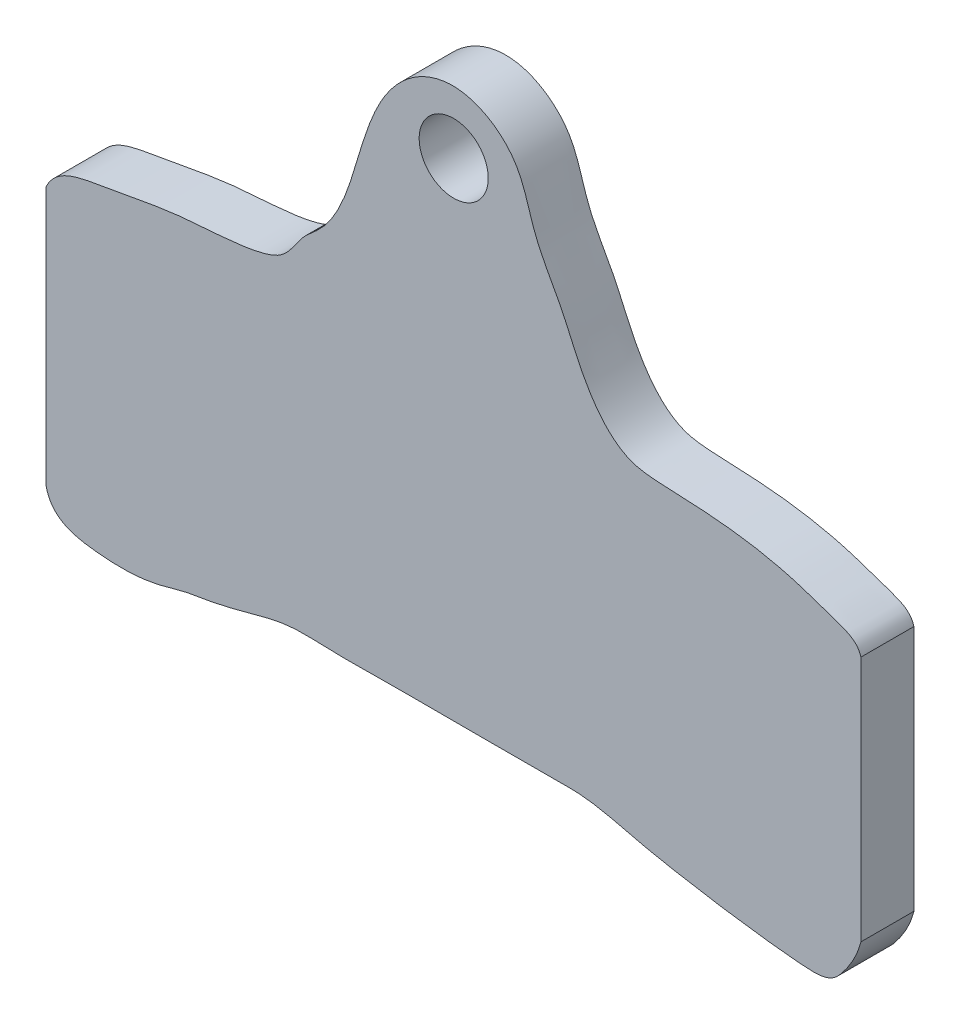
ISO-10303-21;
HEADER;
FILE_DESCRIPTION(('STEP AP214'),'2;1');
FILE_NAME('part.step','',(''),(''),'','','');
FILE_SCHEMA(('AUTOMOTIVE_DESIGN { 1 0 10303 214 1 1 1 1 }'));
ENDSEC;
DATA;
#1=APPLICATION_CONTEXT('core data for automotive mechanical design processes');
#2=APPLICATION_PROTOCOL_DEFINITION('international standard','automotive_design',2000,#1);
#3=PRODUCT_CONTEXT('',#1,'mechanical');
#4=PRODUCT('Part','Part','',(#3));
#5=PRODUCT_RELATED_PRODUCT_CATEGORY('part','',(#4));
#6=PRODUCT_DEFINITION_FORMATION('','',#4);
#7=PRODUCT_DEFINITION_CONTEXT('part definition',#1,'design');
#8=PRODUCT_DEFINITION('design','',#6,#7);
#9=PRODUCT_DEFINITION_SHAPE('','',#8);
#10=(LENGTH_UNIT() NAMED_UNIT(*) SI_UNIT(.MILLI.,.METRE.));
#11=(NAMED_UNIT(*) PLANE_ANGLE_UNIT() SI_UNIT($,.RADIAN.));
#12=(NAMED_UNIT(*) SI_UNIT($,.STERADIAN.) SOLID_ANGLE_UNIT());
#13=UNCERTAINTY_MEASURE_WITH_UNIT(LENGTH_MEASURE(1.E-05),#10,'distance_accuracy_value','');
#14=(GEOMETRIC_REPRESENTATION_CONTEXT(3) GLOBAL_UNCERTAINTY_ASSIGNED_CONTEXT((#13)) GLOBAL_UNIT_ASSIGNED_CONTEXT((#10,
#11,#12)) REPRESENTATION_CONTEXT('',''));
#15=CARTESIAN_POINT('',(0.,0.,0.));
#16=DIRECTION('',(0.,0.,1.));
#17=DIRECTION('',(1.,0.,0.));
#18=AXIS2_PLACEMENT_3D('',#15,#16,#17);
#19=CARTESIAN_POINT('',(30.9284473601599,54.5718095407916,3.8));
#20=DIRECTION('',(0.,0.,1.));
#21=DIRECTION('',(1.,0.,0.));
#22=AXIS2_PLACEMENT_3D('',#19,#20,#21);
#23=PLANE('',#22);
#24=CARTESIAN_POINT('',(60.1059481713367,33.7345558120551,3.8));
#25=CARTESIAN_POINT('',(59.9141223487883,34.464286867927,3.8));
#26=CARTESIAN_POINT('',(58.8611370620931,34.9494551013564,3.8));
#27=CARTESIAN_POINT('',(57.2260122849374,35.4782425190028,3.8));
#28=CARTESIAN_POINT('',(54.3900102713112,36.4794029735116,3.8));
#29=CARTESIAN_POINT('',(50.5185385561697,37.1346389358301,3.8));
#30=CARTESIAN_POINT('',(46.5674272276882,37.2926719448553,3.8));
#31=CARTESIAN_POINT('',(42.8629709774205,37.4816294433254,3.8));
#32=CARTESIAN_POINT('',(40.2225771694843,40.743414327897,3.8));
#33=CARTESIAN_POINT('',(38.8024751430821,44.677393091179,3.8));
#34=CARTESIAN_POINT('',(36.5608202425962,48.1529942316246,3.8));
#35=CARTESIAN_POINT('',(35.9224715698051,51.7608890450939,3.8));
#36=CARTESIAN_POINT('',(33.5639231845027,54.0065015765672,3.8));
#37=CARTESIAN_POINT('',(31.0123339168426,54.8048272035527,3.8));
#38=CARTESIAN_POINT('',(28.6765416131809,54.2078161368735,3.8));
#39=CARTESIAN_POINT('',(25.7017243009681,51.8846296080188,3.8));
#40=CARTESIAN_POINT('',(24.0715140181778,46.8241245917883,3.8));
#41=CARTESIAN_POINT('',(22.6760180554024,41.8513341769035,3.8));
#42=CARTESIAN_POINT('',(19.8703862826899,39.7065345486074,3.8));
#43=CARTESIAN_POINT('',(19.0424772859429,37.8975655709656,3.8));
#44=CARTESIAN_POINT('',(16.2644619365686,37.0497757996661,3.8));
#45=CARTESIAN_POINT('',(13.5716016364334,36.9027341084685,3.8));
#46=CARTESIAN_POINT('',(10.4500749891777,36.6374400645459,3.8));
#47=CARTESIAN_POINT('',(7.89783576133975,36.1586513142713,3.8));
#48=CARTESIAN_POINT('',(4.79532972626533,35.6152884579559,3.8));
#49=CARTESIAN_POINT('',(2.42126894283623,35.2015913232646,3.8));
#50=CARTESIAN_POINT('',(1.74425239919858,33.7345558120551,3.8));
#51=B_SPLINE_CURVE_WITH_KNOTS('',3,(#24,#25,#26,#27,#28,#29,#30,#31,#32,#33,#34,#35,#36,#37,#38,
#39,#40,#41,#42,#43,#44,#45,#46,#47,#48,#49,#50),.UNSPECIFIED.,.F.,.F.,(4,1,1,1,1,1,1,1,1,1,1,1,
1,1,1,1,1,1,1,1,1,1,1,1,4),(0.,0.0250634541372968,0.0421928915203379,0.0660847222620806,
0.139499435152798,0.190104551531277,0.218679739165366,0.276548903707559,0.33258105059043,
0.381378988119061,0.432225561692204,0.467237455373787,0.499849494656716,0.529989206832014,
0.555246343019192,0.64064385420783,0.726041365396468,0.741060338313227,0.774045810064302,
0.795808024612173,0.846684699760862,0.878149861207169,0.915021819996451,0.945269742326023,1.),.UNSPECIFIED.);
#52=CARTESIAN_POINT('',(60.1059481713367,33.7345558120551,3.8));
#53=VERTEX_POINT('',#52);
#54=CARTESIAN_POINT('',(1.74425239919858,33.7345558120551,3.8));
#55=VERTEX_POINT('',#54);
#56=EDGE_CURVE('E83',#53,#55,#51,.T.);
#57=ORIENTED_EDGE('',*,*,#56,.T.);
#58=DIRECTION('',(0.,-1.,0.));
#59=VECTOR('',#58,1.);
#60=CARTESIAN_POINT('',(1.74425239919858,33.7345558120551,3.8));
#61=LINE('',#60,#59);
#62=CARTESIAN_POINT('',(1.74425239919858,15.1875490754157,3.8));
#63=VERTEX_POINT('',#62);
#64=EDGE_CURVE('E78',#55,#63,#61,.T.);
#65=ORIENTED_EDGE('',*,*,#64,.T.);
#66=CARTESIAN_POINT('',(1.74425239919858,15.1875490754157,3.8));
#67=CARTESIAN_POINT('',(2.13632461110477,13.3639235498062,3.8));
#68=CARTESIAN_POINT('',(4.68795818017612,12.8896004496641,3.8));
#69=CARTESIAN_POINT('',(7.77957331531828,12.7222427333981,3.8));
#70=CARTESIAN_POINT('',(9.81563602576158,13.0245368917599,3.8));
#71=CARTESIAN_POINT('',(11.6209508636277,13.6111932385782,3.8));
#72=CARTESIAN_POINT('',(13.6010946451307,13.8708740139952,3.8));
#73=CARTESIAN_POINT('',(16.1691395923189,14.5099873935802,3.8));
#74=CARTESIAN_POINT('',(18.997692079754,15.3459807662854,3.8));
#75=CARTESIAN_POINT('',(22.3635730141919,15.1266476378137,3.8));
#76=CARTESIAN_POINT('',(26.684498743737,15.2184634707171,3.8));
#77=CARTESIAN_POINT('',(31.8430593723484,15.1749994508607,3.8));
#78=CARTESIAN_POINT('',(36.0395400399114,15.1969298245797,3.8));
#79=CARTESIAN_POINT('',(38.5113546432527,15.1812101326006,3.8));
#80=CARTESIAN_POINT('',(40.8702800768843,15.2401155592599,3.8));
#81=CARTESIAN_POINT('',(43.6554755440954,14.4027055214817,3.8));
#82=CARTESIAN_POINT('',(46.8021112932173,13.8067194088054,3.8));
#83=CARTESIAN_POINT('',(49.8848805566492,13.2647247731288,3.8));
#84=CARTESIAN_POINT('',(52.9267948049212,12.8421464762923,3.8));
#85=CARTESIAN_POINT('',(55.8509452690771,12.5232673733602,3.8));
#86=CARTESIAN_POINT('',(57.8932011579778,12.4546785678683,3.8));
#87=CARTESIAN_POINT('',(59.2573286346169,14.025339517117,3.8));
#88=CARTESIAN_POINT('',(59.8662518135312,15.1412697174684,3.8));
#89=CARTESIAN_POINT('',(60.1059481713368,16.0712671010566,3.8));
#90=B_SPLINE_CURVE_WITH_KNOTS('',3,(#66,#67,#68,#69,#70,#71,#72,#73,#74,#75,#76,#77,#78,#79,#80,
#81,#82,#83,#84,#85,#86,#87,#88,#89),.UNSPECIFIED.,.F.,.F.,(4,1,1,1,1,1,1,1,1,1,1,1,1,1,1,1,1,1,
1,1,1,4),(0.,0.0744929527761442,0.112517437328069,0.153165100579433,0.173137191846483,
0.204804800742559,0.249876438386319,0.302183518246306,0.346612334504398,0.412538965080922,
0.512862098566937,0.597420168219435,0.616702395307859,0.633180455987944,0.71196231294387,
0.755809422827581,0.789267524730045,0.864423935203734,0.903513372370301,0.936327344204645,
0.954797396297961,1.),.UNSPECIFIED.);
#91=CARTESIAN_POINT('',(60.1059481713368,16.0712671010566,3.8));
#92=VERTEX_POINT('',#91);
#93=EDGE_CURVE('E81',#63,#92,#90,.T.);
#94=ORIENTED_EDGE('',*,*,#93,.T.);
#95=DIRECTION('',(0.,1.,0.));
#96=VECTOR('',#95,1.);
#97=CARTESIAN_POINT('',(60.1059481713367,33.7345558120551,3.8));
#98=LINE('',#97,#96);
#99=EDGE_CURVE('E48',#92,#53,#98,.T.);
#100=ORIENTED_EDGE('',*,*,#99,.T.);
#101=EDGE_LOOP('',(#57,#65,#94,#100));
#102=FACE_BOUND('',#101,.T.);
#103=CARTESIAN_POINT('',(30.9403356454567,50.0958094775854,3.8));
#104=DIRECTION('',(0.,0.,1.));
#105=DIRECTION('',(1.,0.,0.));
#106=AXIS2_PLACEMENT_3D('',#103,#104,#105);
#107=CIRCLE('',#106,2.47506636686342);
#108=CARTESIAN_POINT('',(28.4652692785933,50.0958094775854,3.8));
#109=VERTEX_POINT('',#108);
#110=EDGE_CURVE('E127',#109,#109,#107,.T.);
#111=ORIENTED_EDGE('',*,*,#110,.F.);
#112=EDGE_LOOP('',(#111));
#113=FACE_BOUND('',#112,.T.);
#114=ADVANCED_FACE('F30',(#102,#113),#23,.T.);
#115=CARTESIAN_POINT('',(30.9284473601599,54.5718095407916,0.));
#116=DIRECTION('',(0.,0.,1.));
#117=DIRECTION('',(1.,0.,0.));
#118=AXIS2_PLACEMENT_3D('',#115,#116,#117);
#119=PLANE('',#118);
#120=CARTESIAN_POINT('',(60.1059481713367,33.7345558120551,0.));
#121=CARTESIAN_POINT('',(59.9141223487883,34.464286867927,0.));
#122=CARTESIAN_POINT('',(58.8611370620931,34.9494551013564,0.));
#123=CARTESIAN_POINT('',(57.2260122849374,35.4782425190028,0.));
#124=CARTESIAN_POINT('',(54.3900102713112,36.4794029735116,0.));
#125=CARTESIAN_POINT('',(50.5185385561697,37.1346389358301,0.));
#126=CARTESIAN_POINT('',(46.5674272276882,37.2926719448553,0.));
#127=CARTESIAN_POINT('',(42.8629709774205,37.4816294433254,0.));
#128=CARTESIAN_POINT('',(40.2225771694843,40.743414327897,0.));
#129=CARTESIAN_POINT('',(38.8024751430821,44.677393091179,0.));
#130=CARTESIAN_POINT('',(36.5608202425962,48.1529942316246,0.));
#131=CARTESIAN_POINT('',(35.9224715698051,51.7608890450939,0.));
#132=CARTESIAN_POINT('',(33.5639231845027,54.0065015765672,0.));
#133=CARTESIAN_POINT('',(31.0123339168426,54.8048272035527,0.));
#134=CARTESIAN_POINT('',(28.6765416131809,54.2078161368735,0.));
#135=CARTESIAN_POINT('',(25.7017243009681,51.8846296080188,0.));
#136=CARTESIAN_POINT('',(24.0715140181778,46.8241245917883,0.));
#137=CARTESIAN_POINT('',(22.6760180554024,41.8513341769035,0.));
#138=CARTESIAN_POINT('',(19.8703862826899,39.7065345486074,0.));
#139=CARTESIAN_POINT('',(19.0424772859429,37.8975655709656,0.));
#140=CARTESIAN_POINT('',(16.2644619365686,37.0497757996661,0.));
#141=CARTESIAN_POINT('',(13.5716016364334,36.9027341084685,0.));
#142=CARTESIAN_POINT('',(10.4500749891777,36.6374400645459,0.));
#143=CARTESIAN_POINT('',(7.89783576133975,36.1586513142713,0.));
#144=CARTESIAN_POINT('',(4.79532972626533,35.6152884579559,0.));
#145=CARTESIAN_POINT('',(2.42126894283623,35.2015913232646,0.));
#146=CARTESIAN_POINT('',(1.74425239919858,33.7345558120551,0.));
#147=B_SPLINE_CURVE_WITH_KNOTS('',3,(#120,#121,#122,#123,#124,#125,#126,#127,#128,#129,#130,
#131,#132,#133,#134,#135,#136,#137,#138,#139,#140,#141,#142,#143,#144,#145,#146),.UNSPECIFIED.,
.F.,.F.,(4,1,1,1,1,1,1,1,1,1,1,1,1,1,1,1,1,1,1,1,1,1,1,1,4),(0.,0.0250634541372968,
0.0421928915203379,0.0660847222620806,0.139499435152798,0.190104551531277,0.218679739165366,
0.276548903707559,0.33258105059043,0.381378988119061,0.432225561692204,0.467237455373787,
0.499849494656716,0.529989206832014,0.555246343019192,0.64064385420783,0.726041365396468,
0.741060338313227,0.774045810064302,0.795808024612173,0.846684699760862,0.878149861207169,
0.915021819996451,0.945269742326023,1.),.UNSPECIFIED.);
#148=CARTESIAN_POINT('',(60.1059481713367,33.7345558120551,0.));
#149=VERTEX_POINT('',#148);
#150=CARTESIAN_POINT('',(1.74425239919858,33.7345558120551,0.));
#151=VERTEX_POINT('',#150);
#152=EDGE_CURVE('E133',#149,#151,#147,.T.);
#153=ORIENTED_EDGE('',*,*,#152,.F.);
#154=DIRECTION('',(0.,1.,0.));
#155=VECTOR('',#154,1.);
#156=CARTESIAN_POINT('',(60.1059481713367,33.7345558120551,0.));
#157=LINE('',#156,#155);
#158=CARTESIAN_POINT('',(60.1059481713368,16.0712671010566,0.));
#159=VERTEX_POINT('',#158);
#160=EDGE_CURVE('E71',#159,#149,#157,.T.);
#161=ORIENTED_EDGE('',*,*,#160,.F.);
#162=CARTESIAN_POINT('',(1.74425239919858,15.1875490754157,0.));
#163=CARTESIAN_POINT('',(2.13632461110477,13.3639235498062,0.));
#164=CARTESIAN_POINT('',(4.68795818017612,12.8896004496641,0.));
#165=CARTESIAN_POINT('',(7.77957331531828,12.7222427333981,0.));
#166=CARTESIAN_POINT('',(9.81563602576158,13.0245368917599,0.));
#167=CARTESIAN_POINT('',(11.6209508636277,13.6111932385782,0.));
#168=CARTESIAN_POINT('',(13.6010946451307,13.8708740139952,0.));
#169=CARTESIAN_POINT('',(16.1691395923189,14.5099873935802,0.));
#170=CARTESIAN_POINT('',(18.997692079754,15.3459807662854,0.));
#171=CARTESIAN_POINT('',(22.3635730141919,15.1266476378137,0.));
#172=CARTESIAN_POINT('',(26.684498743737,15.2184634707171,0.));
#173=CARTESIAN_POINT('',(31.8430593723484,15.1749994508607,0.));
#174=CARTESIAN_POINT('',(36.0395400399114,15.1969298245797,0.));
#175=CARTESIAN_POINT('',(38.5113546432527,15.1812101326006,0.));
#176=CARTESIAN_POINT('',(40.8702800768843,15.2401155592599,0.));
#177=CARTESIAN_POINT('',(43.6554755440954,14.4027055214817,0.));
#178=CARTESIAN_POINT('',(46.8021112932173,13.8067194088054,0.));
#179=CARTESIAN_POINT('',(49.8848805566492,13.2647247731288,0.));
#180=CARTESIAN_POINT('',(52.9267948049212,12.8421464762923,0.));
#181=CARTESIAN_POINT('',(55.8509452690771,12.5232673733602,0.));
#182=CARTESIAN_POINT('',(57.8932011579778,12.4546785678683,0.));
#183=CARTESIAN_POINT('',(59.2573286346169,14.025339517117,0.));
#184=CARTESIAN_POINT('',(59.8662518135312,15.1412697174684,0.));
#185=CARTESIAN_POINT('',(60.1059481713368,16.0712671010566,0.));
#186=B_SPLINE_CURVE_WITH_KNOTS('',3,(#162,#163,#164,#165,#166,#167,#168,#169,#170,#171,#172,
#173,#174,#175,#176,#177,#178,#179,#180,#181,#182,#183,#184,#185),.UNSPECIFIED.,.F.,.F.,(4,1,1,
1,1,1,1,1,1,1,1,1,1,1,1,1,1,1,1,1,1,4),(0.,0.0744929527761442,0.112517437328069,
0.153165100579433,0.173137191846483,0.204804800742559,0.249876438386319,0.302183518246306,
0.346612334504398,0.412538965080922,0.512862098566937,0.597420168219435,0.616702395307859,
0.633180455987944,0.71196231294387,0.755809422827581,0.789267524730045,0.864423935203734,
0.903513372370301,0.936327344204645,0.954797396297961,1.),.UNSPECIFIED.);
#187=CARTESIAN_POINT('',(1.74425239919858,15.1875490754157,0.));
#188=VERTEX_POINT('',#187);
#189=EDGE_CURVE('E65',#188,#159,#186,.T.);
#190=ORIENTED_EDGE('',*,*,#189,.F.);
#191=DIRECTION('',(0.,-1.,0.));
#192=VECTOR('',#191,1.);
#193=CARTESIAN_POINT('',(1.74425239919858,33.7345558120551,0.));
#194=LINE('',#193,#192);
#195=EDGE_CURVE('E87',#151,#188,#194,.T.);
#196=ORIENTED_EDGE('',*,*,#195,.F.);
#197=EDGE_LOOP('',(#153,#161,#190,#196));
#198=FACE_BOUND('',#197,.T.);
#199=CARTESIAN_POINT('',(30.9403356454567,50.0958094775854,0.));
#200=DIRECTION('',(0.,0.,1.));
#201=DIRECTION('',(1.,0.,0.));
#202=AXIS2_PLACEMENT_3D('',#199,#200,#201);
#203=CIRCLE('',#202,2.47506636686342);
#204=CARTESIAN_POINT('',(28.4652692785933,50.0958094775854,0.));
#205=VERTEX_POINT('',#204);
#206=EDGE_CURVE('E130',#205,#205,#203,.T.);
#207=ORIENTED_EDGE('',*,*,#206,.T.);
#208=EDGE_LOOP('',(#207));
#209=FACE_BOUND('',#208,.T.);
#210=ADVANCED_FACE('F109',(#198,#209),#119,.F.);
#211=DIRECTION('',(0.,0.,-1.));
#212=VECTOR('',#211,1.);
#213=SURFACE_OF_LINEAR_EXTRUSION('',#51,#212);
#214=ORIENTED_EDGE('',*,*,#152,.T.);
#215=DIRECTION('',(0.,0.,-1.));
#216=VECTOR('',#215,1.);
#217=CARTESIAN_POINT('',(1.74425239919858,33.7345558120551,3.8));
#218=LINE('',#217,#216);
#219=EDGE_CURVE('E11',#55,#151,#218,.T.);
#220=ORIENTED_EDGE('',*,*,#219,.F.);
#221=ORIENTED_EDGE('',*,*,#56,.F.);
#222=DIRECTION('',(0.,0.,-1.));
#223=VECTOR('',#222,1.);
#224=CARTESIAN_POINT('',(60.1059481713367,33.7345558120551,3.8));
#225=LINE('',#224,#223);
#226=EDGE_CURVE('E91',#53,#149,#225,.T.);
#227=ORIENTED_EDGE('',*,*,#226,.T.);
#228=EDGE_LOOP('',(#214,#220,#221,#227));
#229=FACE_BOUND('',#228,.T.);
#230=ADVANCED_FACE('F32',(#229),#213,.F.);
#231=CARTESIAN_POINT('',(1.74425239919858,33.7345558120551,3.8));
#232=DIRECTION('',(1.,0.,0.));
#233=DIRECTION('',(0.,0.,-1.));
#234=AXIS2_PLACEMENT_3D('',#231,#232,#233);
#235=PLANE('',#234);
#236=ORIENTED_EDGE('',*,*,#195,.T.);
#237=DIRECTION('',(0.,0.,-1.));
#238=VECTOR('',#237,1.);
#239=CARTESIAN_POINT('',(1.74425239919858,15.1875490754157,3.8));
#240=LINE('',#239,#238);
#241=EDGE_CURVE('E40',#63,#188,#240,.T.);
#242=ORIENTED_EDGE('',*,*,#241,.F.);
#243=ORIENTED_EDGE('',*,*,#64,.F.);
#244=ORIENTED_EDGE('',*,*,#219,.T.);
#245=EDGE_LOOP('',(#236,#242,#243,#244));
#246=FACE_BOUND('',#245,.T.);
#247=ADVANCED_FACE('F86',(#246),#235,.F.);
#248=DIRECTION('',(0.,0.,-1.));
#249=VECTOR('',#248,1.);
#250=SURFACE_OF_LINEAR_EXTRUSION('',#90,#249);
#251=ORIENTED_EDGE('',*,*,#189,.T.);
#252=DIRECTION('',(0.,0.,-1.));
#253=VECTOR('',#252,1.);
#254=CARTESIAN_POINT('',(60.1059481713368,16.0712671010566,3.8));
#255=LINE('',#254,#253);
#256=EDGE_CURVE('E88',#92,#159,#255,.T.);
#257=ORIENTED_EDGE('',*,*,#256,.F.);
#258=ORIENTED_EDGE('',*,*,#93,.F.);
#259=ORIENTED_EDGE('',*,*,#241,.T.);
#260=EDGE_LOOP('',(#251,#257,#258,#259));
#261=FACE_BOUND('',#260,.T.);
#262=ADVANCED_FACE('F89',(#261),#250,.F.);
#263=CARTESIAN_POINT('',(60.1059481713367,33.7345558120551,3.8));
#264=DIRECTION('',(-1.,0.,0.));
#265=DIRECTION('',(0.,0.,1.));
#266=AXIS2_PLACEMENT_3D('',#263,#264,#265);
#267=PLANE('',#266);
#268=ORIENTED_EDGE('',*,*,#160,.T.);
#269=ORIENTED_EDGE('',*,*,#226,.F.);
#270=ORIENTED_EDGE('',*,*,#99,.F.);
#271=ORIENTED_EDGE('',*,*,#256,.T.);
#272=EDGE_LOOP('',(#268,#269,#270,#271));
#273=FACE_BOUND('',#272,.T.);
#274=ADVANCED_FACE('F103',(#273),#267,.F.);
#275=CARTESIAN_POINT('',(30.9403356454567,50.0958094775854,3.8));
#276=DIRECTION('',(0.,0.,-1.));
#277=DIRECTION('',(-1.,0.,0.));
#278=AXIS2_PLACEMENT_3D('',#275,#276,#277);
#279=CYLINDRICAL_SURFACE('',#278,2.47506636686342);
#280=CARTESIAN_POINT('',(28.4652692785933,50.0958094775854,3.8));
#281=CARTESIAN_POINT('',(28.4652692785933,50.0958094775854,3.76041666666667));
#282=CARTESIAN_POINT('',(28.4652692785933,50.0958094775854,3.72083333333333));
#283=CARTESIAN_POINT('',(28.4652692785933,50.0958094775854,3.64166666666667));
#284=CARTESIAN_POINT('',(28.4652692785933,50.0958094775854,3.60208333333333));
#285=CARTESIAN_POINT('',(28.4652692785933,50.0958094775854,3.52291666666667));
#286=CARTESIAN_POINT('',(28.4652692785933,50.0958094775854,3.48333333333333));
#287=CARTESIAN_POINT('',(28.4652692785933,50.0958094775854,3.40416666666667));
#288=CARTESIAN_POINT('',(28.4652692785933,50.0958094775854,3.36458333333333));
#289=CARTESIAN_POINT('',(28.4652692785933,50.0958094775854,3.28541666666667));
#290=CARTESIAN_POINT('',(28.4652692785933,50.0958094775854,3.24583333333333));
#291=CARTESIAN_POINT('',(28.4652692785933,50.0958094775854,3.16666666666667));
#292=CARTESIAN_POINT('',(28.4652692785933,50.0958094775854,3.12708333333333));
#293=CARTESIAN_POINT('',(28.4652692785933,50.0958094775854,3.04791666666667));
#294=CARTESIAN_POINT('',(28.4652692785933,50.0958094775854,3.00833333333333));
#295=CARTESIAN_POINT('',(28.4652692785933,50.0958094775854,2.92916666666667));
#296=CARTESIAN_POINT('',(28.4652692785933,50.0958094775854,2.88958333333333));
#297=CARTESIAN_POINT('',(28.4652692785933,50.0958094775854,2.81041666666667));
#298=CARTESIAN_POINT('',(28.4652692785933,50.0958094775854,2.77083333333333));
#299=CARTESIAN_POINT('',(28.4652692785933,50.0958094775854,2.69166666666667));
#300=CARTESIAN_POINT('',(28.4652692785933,50.0958094775854,2.65208333333333));
#301=CARTESIAN_POINT('',(28.4652692785933,50.0958094775854,2.57291666666667));
#302=CARTESIAN_POINT('',(28.4652692785933,50.0958094775854,2.53333333333333));
#303=CARTESIAN_POINT('',(28.4652692785933,50.0958094775854,2.45416666666667));
#304=CARTESIAN_POINT('',(28.4652692785933,50.0958094775854,2.41458333333333));
#305=CARTESIAN_POINT('',(28.4652692785933,50.0958094775854,2.33541666666667));
#306=CARTESIAN_POINT('',(28.4652692785933,50.0958094775854,2.29583333333333));
#307=CARTESIAN_POINT('',(28.4652692785933,50.0958094775854,2.21666666666667));
#308=CARTESIAN_POINT('',(28.4652692785933,50.0958094775854,2.17708333333333));
#309=CARTESIAN_POINT('',(28.4652692785933,50.0958094775854,2.09791666666667));
#310=CARTESIAN_POINT('',(28.4652692785933,50.0958094775854,2.05833333333333));
#311=CARTESIAN_POINT('',(28.4652692785933,50.0958094775854,1.97916666666667));
#312=CARTESIAN_POINT('',(28.4652692785933,50.0958094775854,1.93958333333333));
#313=CARTESIAN_POINT('',(28.4652692785933,50.0958094775854,1.86041666666667));
#314=CARTESIAN_POINT('',(28.4652692785933,50.0958094775854,1.82083333333333));
#315=CARTESIAN_POINT('',(28.4652692785933,50.0958094775854,1.74166666666667));
#316=CARTESIAN_POINT('',(28.4652692785933,50.0958094775854,1.70208333333333));
#317=CARTESIAN_POINT('',(28.4652692785933,50.0958094775854,1.62291666666667));
#318=CARTESIAN_POINT('',(28.4652692785933,50.0958094775854,1.58333333333333));
#319=CARTESIAN_POINT('',(28.4652692785933,50.0958094775854,1.50416666666667));
#320=CARTESIAN_POINT('',(28.4652692785933,50.0958094775854,1.46458333333333));
#321=CARTESIAN_POINT('',(28.4652692785933,50.0958094775854,1.38541666666667));
#322=CARTESIAN_POINT('',(28.4652692785933,50.0958094775854,1.34583333333333));
#323=CARTESIAN_POINT('',(28.4652692785933,50.0958094775854,1.26666666666667));
#324=CARTESIAN_POINT('',(28.4652692785933,50.0958094775854,1.22708333333333));
#325=CARTESIAN_POINT('',(28.4652692785933,50.0958094775854,1.14791666666667));
#326=CARTESIAN_POINT('',(28.4652692785933,50.0958094775854,1.10833333333333));
#327=CARTESIAN_POINT('',(28.4652692785933,50.0958094775854,1.02916666666667));
#328=CARTESIAN_POINT('',(28.4652692785933,50.0958094775854,0.989583333333333));
#329=CARTESIAN_POINT('',(28.4652692785933,50.0958094775854,0.910416666666667));
#330=CARTESIAN_POINT('',(28.4652692785933,50.0958094775854,0.870833333333333));
#331=CARTESIAN_POINT('',(28.4652692785933,50.0958094775854,0.791666666666667));
#332=CARTESIAN_POINT('',(28.4652692785933,50.0958094775854,0.752083333333333));
#333=CARTESIAN_POINT('',(28.4652692785933,50.0958094775854,0.672916666666667));
#334=CARTESIAN_POINT('',(28.4652692785933,50.0958094775854,0.633333333333333));
#335=CARTESIAN_POINT('',(28.4652692785933,50.0958094775854,0.554166666666667));
#336=CARTESIAN_POINT('',(28.4652692785933,50.0958094775854,0.514583333333334));
#337=CARTESIAN_POINT('',(28.4652692785933,50.0958094775854,0.435416666666667));
#338=CARTESIAN_POINT('',(28.4652692785933,50.0958094775854,0.395833333333333));
#339=CARTESIAN_POINT('',(28.4652692785933,50.0958094775854,0.316666666666666));
#340=CARTESIAN_POINT('',(28.4652692785933,50.0958094775854,0.277083333333333));
#341=CARTESIAN_POINT('',(28.4652692785933,50.0958094775854,0.197916666666667));
#342=CARTESIAN_POINT('',(28.4652692785933,50.0958094775854,0.158333333333333));
#343=CARTESIAN_POINT('',(28.4652692785933,50.0958094775854,0.0791666666666666));
#344=CARTESIAN_POINT('',(28.4652692785933,50.0958094775854,0.0395833333333333));
#345=CARTESIAN_POINT('',(28.4652692785933,50.0958094775854,0.));
#346=B_SPLINE_CURVE_WITH_KNOTS('',3,(#280,#281,#282,#283,#284,#285,#286,#287,#288,#289,#290,
#291,#292,#293,#294,#295,#296,#297,#298,#299,#300,#301,#302,#303,#304,#305,#306,#307,#308,#309,
#310,#311,#312,#313,#314,#315,#316,#317,#318,#319,#320,#321,#322,#323,#324,#325,#326,#327,#328,
#329,#330,#331,#332,#333,#334,#335,#336,#337,#338,#339,#340,#341,#342,#343,#344,#345),
.UNSPECIFIED.,.F.,.F.,(4,2,2,2,2,2,2,2,2,2,2,2,2,2,2,2,2,2,2,2,2,2,2,2,2,2,2,2,2,2,2,2,4),(0.,
0.11875,0.2375,0.35625,0.475,0.59375,0.7125,0.831249999999999,0.95,1.06875,1.1875,1.30625,1.425,
1.54375,1.6625,1.78125,1.9,2.01875,2.1375,2.25625,2.375,2.49375,2.6125,2.73125,2.85,2.96875,
3.0875,3.20625,3.325,3.44375,3.5625,3.68125,3.8),.UNSPECIFIED.);
#347=EDGE_CURVE('BSEAM118',#109,#205,#346,.T.);
#348=ORIENTED_EDGE('',*,*,#110,.T.);
#349=ORIENTED_EDGE('',*,*,#206,.F.);
#350=ORIENTED_EDGE('',*,*,#347,.T.);
#351=ORIENTED_EDGE('',*,*,#347,.F.);
#352=EDGE_LOOP('',(#348,#350,#349,#351));
#353=FACE_BOUND('',#352,.T.);
#354=ADVANCED_FACE('F118',(#353),#279,.F.);
#355=CLOSED_SHELL('',(#114,#210,#230,#247,#262,#274,#354));
#356=MANIFOLD_SOLID_BREP('B2',#355);
#357=ADVANCED_BREP_SHAPE_REPRESENTATION('',(#18,#356),#14);
#358=SHAPE_DEFINITION_REPRESENTATION(#9,#357);
ENDSEC;
END-ISO-10303-21;
